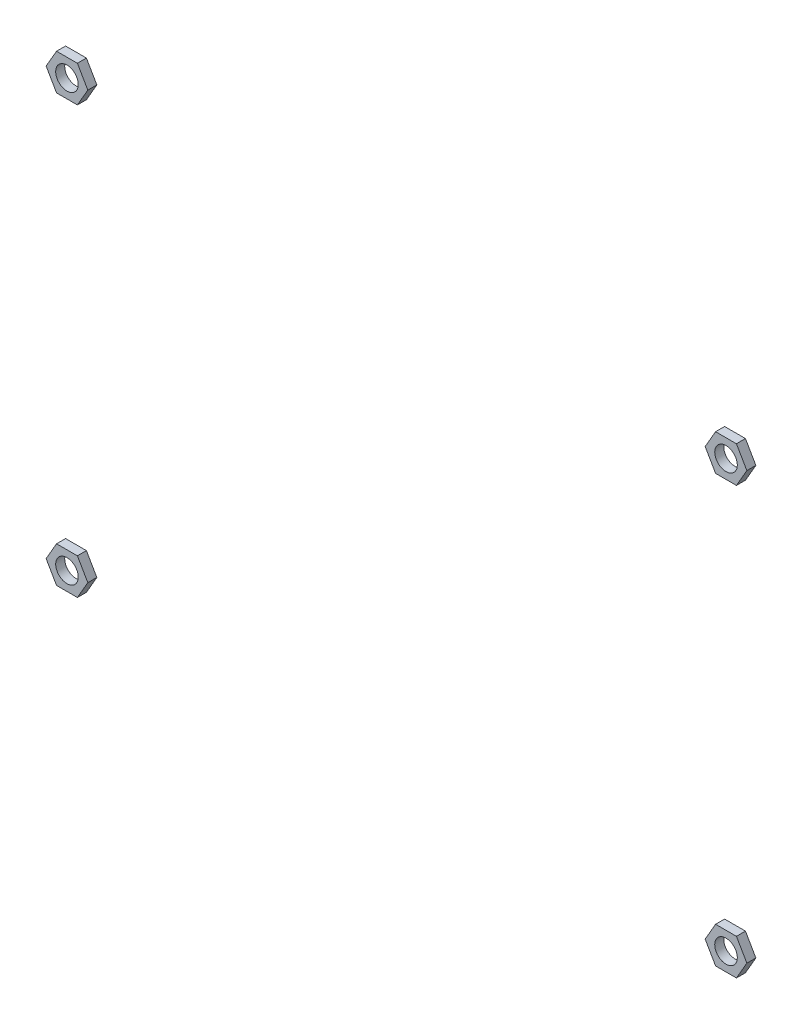
ISO-10303-21;
HEADER;
FILE_DESCRIPTION(('STEP AP214'),'2;1');
FILE_NAME('part.step','',(''),(''),'','','');
FILE_SCHEMA(('AUTOMOTIVE_DESIGN { 1 0 10303 214 1 1 1 1 }'));
ENDSEC;
DATA;
#1=APPLICATION_CONTEXT('core data for automotive mechanical design processes');
#2=APPLICATION_PROTOCOL_DEFINITION('international standard','automotive_design',2000,#1);
#3=PRODUCT_CONTEXT('',#1,'mechanical');
#4=PRODUCT('Part','Part','',(#3));
#5=PRODUCT_RELATED_PRODUCT_CATEGORY('part','',(#4));
#6=PRODUCT_DEFINITION_FORMATION('','',#4);
#7=PRODUCT_DEFINITION_CONTEXT('part definition',#1,'design');
#8=PRODUCT_DEFINITION('design','',#6,#7);
#9=PRODUCT_DEFINITION_SHAPE('','',#8);
#10=(LENGTH_UNIT() NAMED_UNIT(*) SI_UNIT(.MILLI.,.METRE.));
#11=(NAMED_UNIT(*) PLANE_ANGLE_UNIT() SI_UNIT($,.RADIAN.));
#12=(NAMED_UNIT(*) SI_UNIT($,.STERADIAN.) SOLID_ANGLE_UNIT());
#13=UNCERTAINTY_MEASURE_WITH_UNIT(LENGTH_MEASURE(1.E-05),#10,'distance_accuracy_value','');
#14=(GEOMETRIC_REPRESENTATION_CONTEXT(3) GLOBAL_UNCERTAINTY_ASSIGNED_CONTEXT((#13)) GLOBAL_UNIT_ASSIGNED_CONTEXT((#10,
#11,#12)) REPRESENTATION_CONTEXT('',''));
#15=CARTESIAN_POINT('',(0.,0.,0.));
#16=DIRECTION('',(0.,0.,1.));
#17=DIRECTION('',(1.,0.,0.));
#18=AXIS2_PLACEMENT_3D('',#15,#16,#17);
#19=CARTESIAN_POINT('',(252.801279533591,3.41990563164807,4.));
#20=DIRECTION('',(-0.866025403784439,0.5,0.));
#21=DIRECTION('',(-0.5,-0.866025403784439,0.));
#22=AXIS2_PLACEMENT_3D('',#19,#20,#21);
#23=PLANE('',#22);
#24=DIRECTION('',(0.5,0.866025403784439,0.));
#25=VECTOR('',#24,1.);
#26=CARTESIAN_POINT('',(252.801279533591,3.41990563164807,0.));
#27=LINE('',#26,#25);
#28=CARTESIAN_POINT('',(252.801279533591,3.41990563164807,0.));
#29=VERTEX_POINT('',#28);
#30=CARTESIAN_POINT('',(257.420081687108,11.4199056316481,0.));
#31=VERTEX_POINT('',#30);
#32=EDGE_CURVE('E138',#29,#31,#27,.T.);
#33=ORIENTED_EDGE('',*,*,#32,.T.);
#34=DIRECTION('',(0.,0.,-1.));
#35=VECTOR('',#34,1.);
#36=CARTESIAN_POINT('',(257.420081687108,11.4199056316481,4.));
#37=LINE('',#36,#35);
#38=CARTESIAN_POINT('',(257.420081687108,11.4199056316481,4.));
#39=VERTEX_POINT('',#38);
#40=EDGE_CURVE('E12',#39,#31,#37,.T.);
#41=ORIENTED_EDGE('',*,*,#40,.F.);
#42=DIRECTION('',(0.5,0.866025403784439,0.));
#43=VECTOR('',#42,1.);
#44=CARTESIAN_POINT('',(252.801279533591,3.41990563164807,4.));
#45=LINE('',#44,#43);
#46=CARTESIAN_POINT('',(252.801279533591,3.41990563164807,4.));
#47=VERTEX_POINT('',#46);
#48=EDGE_CURVE('E149',#47,#39,#45,.T.);
#49=ORIENTED_EDGE('',*,*,#48,.F.);
#50=DIRECTION('',(0.,0.,-1.));
#51=VECTOR('',#50,1.);
#52=CARTESIAN_POINT('',(252.801279533591,3.41990563164807,4.));
#53=LINE('',#52,#51);
#54=EDGE_CURVE('E134',#47,#29,#53,.T.);
#55=ORIENTED_EDGE('',*,*,#54,.T.);
#56=EDGE_LOOP('',(#33,#41,#49,#55));
#57=FACE_BOUND('',#56,.T.);
#58=ADVANCED_FACE('F54',(#57),#23,.F.);
#59=CARTESIAN_POINT('',(257.420081687108,11.4199056316481,4.));
#60=DIRECTION('',(-0.866025403784439,-0.5,0.));
#61=DIRECTION('',(0.5,-0.866025403784439,0.));
#62=AXIS2_PLACEMENT_3D('',#59,#60,#61);
#63=PLANE('',#62);
#64=DIRECTION('',(-0.5,0.866025403784439,0.));
#65=VECTOR('',#64,1.);
#66=CARTESIAN_POINT('',(257.420081687108,11.4199056316481,0.));
#67=LINE('',#66,#65);
#68=CARTESIAN_POINT('',(252.801279533591,19.4199056316481,0.));
#69=VERTEX_POINT('',#68);
#70=EDGE_CURVE('E141',#31,#69,#67,.T.);
#71=ORIENTED_EDGE('',*,*,#70,.T.);
#72=DIRECTION('',(0.,0.,-1.));
#73=VECTOR('',#72,1.);
#74=CARTESIAN_POINT('',(252.801279533591,19.4199056316481,4.));
#75=LINE('',#74,#73);
#76=CARTESIAN_POINT('',(252.801279533591,19.4199056316481,4.));
#77=VERTEX_POINT('',#76);
#78=EDGE_CURVE('E62',#77,#69,#75,.T.);
#79=ORIENTED_EDGE('',*,*,#78,.F.);
#80=DIRECTION('',(-0.5,0.866025403784439,0.));
#81=VECTOR('',#80,1.);
#82=CARTESIAN_POINT('',(257.420081687108,11.4199056316481,4.));
#83=LINE('',#82,#81);
#84=EDGE_CURVE('E107',#39,#77,#83,.T.);
#85=ORIENTED_EDGE('',*,*,#84,.F.);
#86=ORIENTED_EDGE('',*,*,#40,.T.);
#87=EDGE_LOOP('',(#71,#79,#85,#86));
#88=FACE_BOUND('',#87,.T.);
#89=ADVANCED_FACE('F174',(#88),#63,.F.);
#90=CARTESIAN_POINT('',(252.801279533591,19.4199056316481,4.));
#91=DIRECTION('',(0.,-1.,0.));
#92=DIRECTION('',(0.,0.,-1.));
#93=AXIS2_PLACEMENT_3D('',#90,#91,#92);
#94=PLANE('',#93);
#95=DIRECTION('',(-1.,0.,0.));
#96=VECTOR('',#95,1.);
#97=CARTESIAN_POINT('',(252.801279533591,19.4199056316481,0.));
#98=LINE('',#97,#96);
#99=CARTESIAN_POINT('',(243.563675226557,19.4199056316481,0.));
#100=VERTEX_POINT('',#99);
#101=EDGE_CURVE('E144',#69,#100,#98,.T.);
#102=ORIENTED_EDGE('',*,*,#101,.T.);
#103=DIRECTION('',(0.,0.,-1.));
#104=VECTOR('',#103,1.);
#105=CARTESIAN_POINT('',(243.563675226557,19.4199056316481,4.));
#106=LINE('',#105,#104);
#107=CARTESIAN_POINT('',(243.563675226557,19.4199056316481,4.));
#108=VERTEX_POINT('',#107);
#109=EDGE_CURVE('E129',#108,#100,#106,.T.);
#110=ORIENTED_EDGE('',*,*,#109,.F.);
#111=DIRECTION('',(-1.,0.,0.));
#112=VECTOR('',#111,1.);
#113=CARTESIAN_POINT('',(252.801279533591,19.4199056316481,4.));
#114=LINE('',#113,#112);
#115=EDGE_CURVE('E120',#77,#108,#114,.T.);
#116=ORIENTED_EDGE('',*,*,#115,.F.);
#117=ORIENTED_EDGE('',*,*,#78,.T.);
#118=EDGE_LOOP('',(#102,#110,#116,#117));
#119=FACE_BOUND('',#118,.T.);
#120=ADVANCED_FACE('F155',(#119),#94,.F.);
#121=CARTESIAN_POINT('',(243.563675226557,19.4199056316481,4.));
#122=DIRECTION('',(0.866025403784439,-0.499999999999999,0.));
#123=DIRECTION('',(0.499999999999999,0.866025403784439,0.));
#124=AXIS2_PLACEMENT_3D('',#121,#122,#123);
#125=PLANE('',#124);
#126=DIRECTION('',(-0.499999999999999,-0.866025403784439,0.));
#127=VECTOR('',#126,1.);
#128=CARTESIAN_POINT('',(243.563675226557,19.4199056316481,0.));
#129=LINE('',#128,#127);
#130=CARTESIAN_POINT('',(238.94487307304,11.4199056316481,0.));
#131=VERTEX_POINT('',#130);
#132=EDGE_CURVE('E128',#100,#131,#129,.T.);
#133=ORIENTED_EDGE('',*,*,#132,.T.);
#134=DIRECTION('',(0.,0.,-1.));
#135=VECTOR('',#134,1.);
#136=CARTESIAN_POINT('',(238.94487307304,11.4199056316481,4.));
#137=LINE('',#136,#135);
#138=CARTESIAN_POINT('',(238.94487307304,11.4199056316481,4.));
#139=VERTEX_POINT('',#138);
#140=EDGE_CURVE('E125',#139,#131,#137,.T.);
#141=ORIENTED_EDGE('',*,*,#140,.F.);
#142=DIRECTION('',(-0.499999999999999,-0.866025403784439,0.));
#143=VECTOR('',#142,1.);
#144=CARTESIAN_POINT('',(243.563675226557,19.4199056316481,4.));
#145=LINE('',#144,#143);
#146=EDGE_CURVE('E114',#108,#139,#145,.T.);
#147=ORIENTED_EDGE('',*,*,#146,.F.);
#148=ORIENTED_EDGE('',*,*,#109,.T.);
#149=EDGE_LOOP('',(#133,#141,#147,#148));
#150=FACE_BOUND('',#149,.T.);
#151=ADVANCED_FACE('F126',(#150),#125,.F.);
#152=CARTESIAN_POINT('',(238.94487307304,11.4199056316481,4.));
#153=DIRECTION('',(0.866025403784439,0.5,0.));
#154=DIRECTION('',(-0.5,0.866025403784439,0.));
#155=AXIS2_PLACEMENT_3D('',#152,#153,#154);
#156=PLANE('',#155);
#157=DIRECTION('',(0.5,-0.866025403784439,0.));
#158=VECTOR('',#157,1.);
#159=CARTESIAN_POINT('',(238.94487307304,11.4199056316481,0.));
#160=LINE('',#159,#158);
#161=CARTESIAN_POINT('',(243.563675226557,3.41990563164807,0.));
#162=VERTEX_POINT('',#161);
#163=EDGE_CURVE('E93',#131,#162,#160,.T.);
#164=ORIENTED_EDGE('',*,*,#163,.T.);
#165=DIRECTION('',(0.,0.,-1.));
#166=VECTOR('',#165,1.);
#167=CARTESIAN_POINT('',(243.563675226557,3.41990563164807,4.));
#168=LINE('',#167,#166);
#169=CARTESIAN_POINT('',(243.563675226557,3.41990563164807,4.));
#170=VERTEX_POINT('',#169);
#171=EDGE_CURVE('E130',#170,#162,#168,.T.);
#172=ORIENTED_EDGE('',*,*,#171,.F.);
#173=DIRECTION('',(0.5,-0.866025403784439,0.));
#174=VECTOR('',#173,1.);
#175=CARTESIAN_POINT('',(238.94487307304,11.4199056316481,4.));
#176=LINE('',#175,#174);
#177=EDGE_CURVE('E118',#139,#170,#176,.T.);
#178=ORIENTED_EDGE('',*,*,#177,.F.);
#179=ORIENTED_EDGE('',*,*,#140,.T.);
#180=EDGE_LOOP('',(#164,#172,#178,#179));
#181=FACE_BOUND('',#180,.T.);
#182=ADVANCED_FACE('F132',(#181),#156,.F.);
#183=CARTESIAN_POINT('',(243.563675226557,3.41990563164807,4.));
#184=DIRECTION('',(0.,1.,0.));
#185=DIRECTION('',(-1.,0.,0.));
#186=AXIS2_PLACEMENT_3D('',#183,#184,#185);
#187=PLANE('',#186);
#188=DIRECTION('',(1.,0.,0.));
#189=VECTOR('',#188,1.);
#190=CARTESIAN_POINT('',(243.563675226557,3.41990563164807,0.));
#191=LINE('',#190,#189);
#192=EDGE_CURVE('E99',#162,#29,#191,.T.);
#193=ORIENTED_EDGE('',*,*,#192,.T.);
#194=ORIENTED_EDGE('',*,*,#54,.F.);
#195=DIRECTION('',(1.,0.,0.));
#196=VECTOR('',#195,1.);
#197=CARTESIAN_POINT('',(243.563675226557,3.41990563164807,4.));
#198=LINE('',#197,#196);
#199=EDGE_CURVE('E70',#170,#47,#198,.T.);
#200=ORIENTED_EDGE('',*,*,#199,.F.);
#201=ORIENTED_EDGE('',*,*,#171,.T.);
#202=EDGE_LOOP('',(#193,#194,#200,#201));
#203=FACE_BOUND('',#202,.T.);
#204=ADVANCED_FACE('F162',(#203),#187,.F.);
#205=CARTESIAN_POINT('',(292.,0.,4.));
#206=DIRECTION('',(0.,0.,1.));
#207=DIRECTION('',(1.,0.,0.));
#208=AXIS2_PLACEMENT_3D('',#205,#206,#207);
#209=PLANE('',#208);
#210=CARTESIAN_POINT('',(248.182477380074,11.4199056316481,4.));
#211=DIRECTION('',(0.,0.,-1.));
#212=DIRECTION('',(-1.,0.,0.));
#213=AXIS2_PLACEMENT_3D('',#210,#211,#212);
#214=CIRCLE('',#213,5.);
#215=CARTESIAN_POINT('',(243.182477380074,11.4199056316481,4.));
#216=VERTEX_POINT('',#215);
#217=EDGE_CURVE('E142',#216,#216,#214,.T.);
#218=ORIENTED_EDGE('',*,*,#217,.T.);
#219=EDGE_LOOP('',(#218));
#220=FACE_BOUND('',#219,.T.);
#221=ORIENTED_EDGE('',*,*,#48,.T.);
#222=ORIENTED_EDGE('',*,*,#84,.T.);
#223=ORIENTED_EDGE('',*,*,#115,.T.);
#224=ORIENTED_EDGE('',*,*,#146,.T.);
#225=ORIENTED_EDGE('',*,*,#177,.T.);
#226=ORIENTED_EDGE('',*,*,#199,.T.);
#227=EDGE_LOOP('',(#221,#222,#223,#224,#225,#226));
#228=FACE_BOUND('',#227,.T.);
#229=ADVANCED_FACE('F116',(#220,#228),#209,.T.);
#230=CARTESIAN_POINT('',(292.,0.,0.));
#231=DIRECTION('',(0.,0.,1.));
#232=DIRECTION('',(1.,0.,0.));
#233=AXIS2_PLACEMENT_3D('',#230,#231,#232);
#234=PLANE('',#233);
#235=CARTESIAN_POINT('',(248.182477380074,11.4199056316481,0.));
#236=DIRECTION('',(0.,0.,-1.));
#237=DIRECTION('',(-1.,0.,0.));
#238=AXIS2_PLACEMENT_3D('',#235,#236,#237);
#239=CIRCLE('',#238,5.);
#240=CARTESIAN_POINT('',(243.182477380074,11.4199056316481,0.));
#241=VERTEX_POINT('',#240);
#242=EDGE_CURVE('E261',#241,#241,#239,.T.);
#243=ORIENTED_EDGE('',*,*,#242,.F.);
#244=EDGE_LOOP('',(#243));
#245=FACE_BOUND('',#244,.T.);
#246=ORIENTED_EDGE('',*,*,#32,.F.);
#247=ORIENTED_EDGE('',*,*,#192,.F.);
#248=ORIENTED_EDGE('',*,*,#163,.F.);
#249=ORIENTED_EDGE('',*,*,#132,.F.);
#250=ORIENTED_EDGE('',*,*,#101,.F.);
#251=ORIENTED_EDGE('',*,*,#70,.F.);
#252=EDGE_LOOP('',(#246,#247,#248,#249,#250,#251));
#253=FACE_BOUND('',#252,.T.);
#254=ADVANCED_FACE('F158',(#245,#253),#234,.F.);
#255=CARTESIAN_POINT('',(248.182477380074,11.4199056316481,4.));
#256=DIRECTION('',(0.,0.,-1.));
#257=DIRECTION('',(-1.,0.,0.));
#258=AXIS2_PLACEMENT_3D('',#255,#256,#257);
#259=CYLINDRICAL_SURFACE('',#258,5.);
#260=ORIENTED_EDGE('',*,*,#217,.F.);
#261=EDGE_LOOP('',(#260));
#262=FACE_BOUND('',#261,.T.);
#263=ORIENTED_EDGE('',*,*,#242,.T.);
#264=EDGE_LOOP('',(#263));
#265=FACE_BOUND('',#264,.T.);
#266=ADVANCED_FACE('F214',(#262,#265),#259,.F.);
#267=CLOSED_SHELL('',(#58,#89,#120,#151,#182,#204,#229,#254,#266));
#268=MANIFOLD_SOLID_BREP('B2',#267);
#269=CARTESIAN_POINT('',(252.801279533591,192.419905631648,4.));
#270=DIRECTION('',(-0.866025403784439,0.5,0.));
#271=DIRECTION('',(-0.5,-0.866025403784439,0.));
#272=AXIS2_PLACEMENT_3D('',#269,#270,#271);
#273=PLANE('',#272);
#274=DIRECTION('',(0.5,0.866025403784439,0.));
#275=VECTOR('',#274,1.);
#276=CARTESIAN_POINT('',(252.801279533591,192.419905631648,0.));
#277=LINE('',#276,#275);
#278=CARTESIAN_POINT('',(252.801279533591,192.419905631648,0.));
#279=VERTEX_POINT('',#278);
#280=CARTESIAN_POINT('',(257.420081687108,200.419905631648,0.));
#281=VERTEX_POINT('',#280);
#282=EDGE_CURVE('E368',#279,#281,#277,.T.);
#283=ORIENTED_EDGE('',*,*,#282,.T.);
#284=DIRECTION('',(0.,0.,-1.));
#285=VECTOR('',#284,1.);
#286=CARTESIAN_POINT('',(257.420081687108,200.419905631648,4.));
#287=LINE('',#286,#285);
#288=CARTESIAN_POINT('',(257.420081687108,200.419905631648,4.));
#289=VERTEX_POINT('',#288);
#290=EDGE_CURVE('E52',#289,#281,#287,.T.);
#291=ORIENTED_EDGE('',*,*,#290,.F.);
#292=DIRECTION('',(0.5,0.866025403784439,0.));
#293=VECTOR('',#292,1.);
#294=CARTESIAN_POINT('',(252.801279533591,192.419905631648,4.));
#295=LINE('',#294,#293);
#296=CARTESIAN_POINT('',(252.801279533591,192.419905631648,4.));
#297=VERTEX_POINT('',#296);
#298=EDGE_CURVE('E385',#297,#289,#295,.T.);
#299=ORIENTED_EDGE('',*,*,#298,.F.);
#300=DIRECTION('',(0.,0.,-1.));
#301=VECTOR('',#300,1.);
#302=CARTESIAN_POINT('',(252.801279533591,192.419905631648,4.));
#303=LINE('',#302,#301);
#304=EDGE_CURVE('E364',#297,#279,#303,.T.);
#305=ORIENTED_EDGE('',*,*,#304,.T.);
#306=EDGE_LOOP('',(#283,#291,#299,#305));
#307=FACE_BOUND('',#306,.T.);
#308=ADVANCED_FACE('F279',(#307),#273,.F.);
#309=CARTESIAN_POINT('',(257.420081687108,200.419905631648,4.));
#310=DIRECTION('',(-0.866025403784439,-0.5,0.));
#311=DIRECTION('',(0.5,-0.866025403784439,0.));
#312=AXIS2_PLACEMENT_3D('',#309,#310,#311);
#313=PLANE('',#312);
#314=DIRECTION('',(-0.5,0.866025403784439,0.));
#315=VECTOR('',#314,1.);
#316=CARTESIAN_POINT('',(257.420081687108,200.419905631648,0.));
#317=LINE('',#316,#315);
#318=CARTESIAN_POINT('',(252.801279533591,208.419905631648,0.));
#319=VERTEX_POINT('',#318);
#320=EDGE_CURVE('E372',#281,#319,#317,.T.);
#321=ORIENTED_EDGE('',*,*,#320,.T.);
#322=DIRECTION('',(0.,0.,-1.));
#323=VECTOR('',#322,1.);
#324=CARTESIAN_POINT('',(252.801279533591,208.419905631648,4.));
#325=LINE('',#324,#323);
#326=CARTESIAN_POINT('',(252.801279533591,208.419905631648,4.));
#327=VERTEX_POINT('',#326);
#328=EDGE_CURVE('E288',#327,#319,#325,.T.);
#329=ORIENTED_EDGE('',*,*,#328,.F.);
#330=DIRECTION('',(-0.5,0.866025403784439,0.));
#331=VECTOR('',#330,1.);
#332=CARTESIAN_POINT('',(257.420081687108,200.419905631648,4.));
#333=LINE('',#332,#331);
#334=EDGE_CURVE('E333',#289,#327,#333,.T.);
#335=ORIENTED_EDGE('',*,*,#334,.F.);
#336=ORIENTED_EDGE('',*,*,#290,.T.);
#337=EDGE_LOOP('',(#321,#329,#335,#336));
#338=FACE_BOUND('',#337,.T.);
#339=ADVANCED_FACE('F414',(#338),#313,.F.);
#340=CARTESIAN_POINT('',(252.801279533591,208.419905631648,4.));
#341=DIRECTION('',(0.,-1.,0.));
#342=DIRECTION('',(0.,0.,-1.));
#343=AXIS2_PLACEMENT_3D('',#340,#341,#342);
#344=PLANE('',#343);
#345=DIRECTION('',(-1.,0.,0.));
#346=VECTOR('',#345,1.);
#347=CARTESIAN_POINT('',(252.801279533591,208.419905631648,0.));
#348=LINE('',#347,#346);
#349=CARTESIAN_POINT('',(243.563675226557,208.419905631648,0.));
#350=VERTEX_POINT('',#349);
#351=EDGE_CURVE('E376',#319,#350,#348,.T.);
#352=ORIENTED_EDGE('',*,*,#351,.T.);
#353=DIRECTION('',(0.,0.,-1.));
#354=VECTOR('',#353,1.);
#355=CARTESIAN_POINT('',(243.563675226557,208.419905631648,4.));
#356=LINE('',#355,#354);
#357=CARTESIAN_POINT('',(243.563675226557,208.419905631648,4.));
#358=VERTEX_POINT('',#357);
#359=EDGE_CURVE('E357',#358,#350,#356,.T.);
#360=ORIENTED_EDGE('',*,*,#359,.F.);
#361=DIRECTION('',(-1.,0.,0.));
#362=VECTOR('',#361,1.);
#363=CARTESIAN_POINT('',(252.801279533591,208.419905631648,4.));
#364=LINE('',#363,#362);
#365=EDGE_CURVE('E346',#327,#358,#364,.T.);
#366=ORIENTED_EDGE('',*,*,#365,.F.);
#367=ORIENTED_EDGE('',*,*,#328,.T.);
#368=EDGE_LOOP('',(#352,#360,#366,#367));
#369=FACE_BOUND('',#368,.T.);
#370=ADVANCED_FACE('F395',(#369),#344,.F.);
#371=CARTESIAN_POINT('',(243.563675226557,208.419905631648,4.));
#372=DIRECTION('',(0.866025403784439,-0.499999999999999,0.));
#373=DIRECTION('',(0.499999999999999,0.866025403784439,0.));
#374=AXIS2_PLACEMENT_3D('',#371,#372,#373);
#375=PLANE('',#374);
#376=DIRECTION('',(-0.499999999999999,-0.866025403784439,0.));
#377=VECTOR('',#376,1.);
#378=CARTESIAN_POINT('',(243.563675226557,208.419905631648,0.));
#379=LINE('',#378,#377);
#380=CARTESIAN_POINT('',(238.94487307304,200.419905631648,0.));
#381=VERTEX_POINT('',#380);
#382=EDGE_CURVE('E355',#350,#381,#379,.T.);
#383=ORIENTED_EDGE('',*,*,#382,.T.);
#384=DIRECTION('',(0.,0.,-1.));
#385=VECTOR('',#384,1.);
#386=CARTESIAN_POINT('',(238.94487307304,200.419905631648,4.));
#387=LINE('',#386,#385);
#388=CARTESIAN_POINT('',(238.94487307304,200.419905631648,4.));
#389=VERTEX_POINT('',#388);
#390=EDGE_CURVE('E352',#389,#381,#387,.T.);
#391=ORIENTED_EDGE('',*,*,#390,.F.);
#392=DIRECTION('',(-0.499999999999999,-0.866025403784439,0.));
#393=VECTOR('',#392,1.);
#394=CARTESIAN_POINT('',(243.563675226557,208.419905631648,4.));
#395=LINE('',#394,#393);
#396=EDGE_CURVE('E340',#358,#389,#395,.T.);
#397=ORIENTED_EDGE('',*,*,#396,.F.);
#398=ORIENTED_EDGE('',*,*,#359,.T.);
#399=EDGE_LOOP('',(#383,#391,#397,#398));
#400=FACE_BOUND('',#399,.T.);
#401=ADVANCED_FACE('F353',(#400),#375,.F.);
#402=CARTESIAN_POINT('',(238.94487307304,200.419905631648,4.));
#403=DIRECTION('',(0.866025403784439,0.5,0.));
#404=DIRECTION('',(-0.5,0.866025403784439,0.));
#405=AXIS2_PLACEMENT_3D('',#402,#403,#404);
#406=PLANE('',#405);
#407=DIRECTION('',(0.5,-0.866025403784439,0.));
#408=VECTOR('',#407,1.);
#409=CARTESIAN_POINT('',(238.94487307304,200.419905631648,0.));
#410=LINE('',#409,#408);
#411=CARTESIAN_POINT('',(243.563675226557,192.419905631648,0.));
#412=VERTEX_POINT('',#411);
#413=EDGE_CURVE('E319',#381,#412,#410,.T.);
#414=ORIENTED_EDGE('',*,*,#413,.T.);
#415=DIRECTION('',(0.,0.,-1.));
#416=VECTOR('',#415,1.);
#417=CARTESIAN_POINT('',(243.563675226557,192.419905631648,4.));
#418=LINE('',#417,#416);
#419=CARTESIAN_POINT('',(243.563675226557,192.419905631648,4.));
#420=VERTEX_POINT('',#419);
#421=EDGE_CURVE('E358',#420,#412,#418,.T.);
#422=ORIENTED_EDGE('',*,*,#421,.F.);
#423=DIRECTION('',(0.5,-0.866025403784439,0.));
#424=VECTOR('',#423,1.);
#425=CARTESIAN_POINT('',(238.94487307304,200.419905631648,4.));
#426=LINE('',#425,#424);
#427=EDGE_CURVE('E344',#389,#420,#426,.T.);
#428=ORIENTED_EDGE('',*,*,#427,.F.);
#429=ORIENTED_EDGE('',*,*,#390,.T.);
#430=EDGE_LOOP('',(#414,#422,#428,#429));
#431=FACE_BOUND('',#430,.T.);
#432=ADVANCED_FACE('F360',(#431),#406,.F.);
#433=CARTESIAN_POINT('',(243.563675226557,192.419905631648,4.));
#434=DIRECTION('',(0.,1.,0.));
#435=DIRECTION('',(-1.,0.,0.));
#436=AXIS2_PLACEMENT_3D('',#433,#434,#435);
#437=PLANE('',#436);
#438=DIRECTION('',(1.,0.,0.));
#439=VECTOR('',#438,1.);
#440=CARTESIAN_POINT('',(243.563675226557,192.419905631648,0.));
#441=LINE('',#440,#439);
#442=EDGE_CURVE('E325',#412,#279,#441,.T.);
#443=ORIENTED_EDGE('',*,*,#442,.T.);
#444=ORIENTED_EDGE('',*,*,#304,.F.);
#445=DIRECTION('',(1.,0.,0.));
#446=VECTOR('',#445,1.);
#447=CARTESIAN_POINT('',(243.563675226557,192.419905631648,4.));
#448=LINE('',#447,#446);
#449=EDGE_CURVE('E296',#420,#297,#448,.T.);
#450=ORIENTED_EDGE('',*,*,#449,.F.);
#451=ORIENTED_EDGE('',*,*,#421,.T.);
#452=EDGE_LOOP('',(#443,#444,#450,#451));
#453=FACE_BOUND('',#452,.T.);
#454=ADVANCED_FACE('F402',(#453),#437,.F.);
#455=CARTESIAN_POINT('',(292.,189.,4.));
#456=DIRECTION('',(0.,0.,1.));
#457=DIRECTION('',(1.,0.,0.));
#458=AXIS2_PLACEMENT_3D('',#455,#456,#457);
#459=PLANE('',#458);
#460=CARTESIAN_POINT('',(248.182477380074,200.419905631648,4.));
#461=DIRECTION('',(0.,0.,-1.));
#462=DIRECTION('',(-1.,0.,0.));
#463=AXIS2_PLACEMENT_3D('',#460,#461,#462);
#464=CIRCLE('',#463,5.);
#465=CARTESIAN_POINT('',(243.182477380074,200.419905631648,4.));
#466=VERTEX_POINT('',#465);
#467=EDGE_CURVE('E373',#466,#466,#464,.T.);
#468=ORIENTED_EDGE('',*,*,#467,.T.);
#469=EDGE_LOOP('',(#468));
#470=FACE_BOUND('',#469,.T.);
#471=ORIENTED_EDGE('',*,*,#298,.T.);
#472=ORIENTED_EDGE('',*,*,#334,.T.);
#473=ORIENTED_EDGE('',*,*,#365,.T.);
#474=ORIENTED_EDGE('',*,*,#396,.T.);
#475=ORIENTED_EDGE('',*,*,#427,.T.);
#476=ORIENTED_EDGE('',*,*,#449,.T.);
#477=EDGE_LOOP('',(#471,#472,#473,#474,#475,#476));
#478=FACE_BOUND('',#477,.T.);
#479=ADVANCED_FACE('F342',(#470,#478),#459,.T.);
#480=CARTESIAN_POINT('',(292.,189.,0.));
#481=DIRECTION('',(0.,0.,1.));
#482=DIRECTION('',(1.,0.,0.));
#483=AXIS2_PLACEMENT_3D('',#480,#481,#482);
#484=PLANE('',#483);
#485=CARTESIAN_POINT('',(248.182477380074,200.419905631648,0.));
#486=DIRECTION('',(0.,0.,-1.));
#487=DIRECTION('',(-1.,0.,0.));
#488=AXIS2_PLACEMENT_3D('',#485,#486,#487);
#489=CIRCLE('',#488,5.);
#490=CARTESIAN_POINT('',(243.182477380074,200.419905631648,0.));
#491=VERTEX_POINT('',#490);
#492=EDGE_CURVE('E501',#491,#491,#489,.T.);
#493=ORIENTED_EDGE('',*,*,#492,.F.);
#494=EDGE_LOOP('',(#493));
#495=FACE_BOUND('',#494,.T.);
#496=ORIENTED_EDGE('',*,*,#282,.F.);
#497=ORIENTED_EDGE('',*,*,#442,.F.);
#498=ORIENTED_EDGE('',*,*,#413,.F.);
#499=ORIENTED_EDGE('',*,*,#382,.F.);
#500=ORIENTED_EDGE('',*,*,#351,.F.);
#501=ORIENTED_EDGE('',*,*,#320,.F.);
#502=EDGE_LOOP('',(#496,#497,#498,#499,#500,#501));
#503=FACE_BOUND('',#502,.T.);
#504=ADVANCED_FACE('F398',(#495,#503),#484,.F.);
#505=CARTESIAN_POINT('',(248.182477380074,200.419905631648,4.));
#506=DIRECTION('',(0.,0.,-1.));
#507=DIRECTION('',(-1.,0.,0.));
#508=AXIS2_PLACEMENT_3D('',#505,#506,#507);
#509=CYLINDRICAL_SURFACE('',#508,5.);
#510=ORIENTED_EDGE('',*,*,#467,.F.);
#511=EDGE_LOOP('',(#510));
#512=FACE_BOUND('',#511,.T.);
#513=ORIENTED_EDGE('',*,*,#492,.T.);
#514=EDGE_LOOP('',(#513));
#515=FACE_BOUND('',#514,.T.);
#516=ADVANCED_FACE('F454',(#512,#515),#509,.F.);
#517=CLOSED_SHELL('',(#308,#339,#370,#401,#432,#454,#479,#504,#516));
#518=MANIFOLD_SOLID_BREP('B6',#517);
#519=CARTESIAN_POINT('',(-39.1987204664091,192.419905631648,4.));
#520=DIRECTION('',(-0.866025403784439,0.5,0.));
#521=DIRECTION('',(-0.5,-0.866025403784439,0.));
#522=AXIS2_PLACEMENT_3D('',#519,#520,#521);
#523=PLANE('',#522);
#524=DIRECTION('',(0.5,0.866025403784439,0.));
#525=VECTOR('',#524,1.);
#526=CARTESIAN_POINT('',(-39.1987204664091,192.419905631648,0.));
#527=LINE('',#526,#525);
#528=CARTESIAN_POINT('',(-39.1987204664091,192.419905631648,0.));
#529=VERTEX_POINT('',#528);
#530=CARTESIAN_POINT('',(-34.5799183128921,200.419905631648,0.));
#531=VERTEX_POINT('',#530);
#532=EDGE_CURVE('E607',#529,#531,#527,.T.);
#533=ORIENTED_EDGE('',*,*,#532,.T.);
#534=DIRECTION('',(0.,0.,-1.));
#535=VECTOR('',#534,1.);
#536=CARTESIAN_POINT('',(-34.5799183128921,200.419905631648,4.));
#537=LINE('',#536,#535);
#538=CARTESIAN_POINT('',(-34.5799183128921,200.419905631648,4.));
#539=VERTEX_POINT('',#538);
#540=EDGE_CURVE('E277',#539,#531,#537,.T.);
#541=ORIENTED_EDGE('',*,*,#540,.F.);
#542=DIRECTION('',(0.5,0.866025403784439,0.));
#543=VECTOR('',#542,1.);
#544=CARTESIAN_POINT('',(-39.1987204664091,192.419905631648,4.));
#545=LINE('',#544,#543);
#546=CARTESIAN_POINT('',(-39.1987204664091,192.419905631648,4.));
#547=VERTEX_POINT('',#546);
#548=EDGE_CURVE('E618',#547,#539,#545,.T.);
#549=ORIENTED_EDGE('',*,*,#548,.F.);
#550=DIRECTION('',(0.,0.,-1.));
#551=VECTOR('',#550,1.);
#552=CARTESIAN_POINT('',(-39.1987204664091,192.419905631648,4.));
#553=LINE('',#552,#551);
#554=EDGE_CURVE('E603',#547,#529,#553,.T.);
#555=ORIENTED_EDGE('',*,*,#554,.T.);
#556=EDGE_LOOP('',(#533,#541,#549,#555));
#557=FACE_BOUND('',#556,.T.);
#558=ADVANCED_FACE('F523',(#557),#523,.F.);
#559=CARTESIAN_POINT('',(-34.5799183128921,200.419905631648,4.));
#560=DIRECTION('',(-0.866025403784439,-0.5,0.));
#561=DIRECTION('',(0.5,-0.866025403784439,0.));
#562=AXIS2_PLACEMENT_3D('',#559,#560,#561);
#563=PLANE('',#562);
#564=DIRECTION('',(-0.5,0.866025403784439,0.));
#565=VECTOR('',#564,1.);
#566=CARTESIAN_POINT('',(-34.5799183128921,200.419905631648,0.));
#567=LINE('',#566,#565);
#568=CARTESIAN_POINT('',(-39.1987204664092,208.419905631648,0.));
#569=VERTEX_POINT('',#568);
#570=EDGE_CURVE('E610',#531,#569,#567,.T.);
#571=ORIENTED_EDGE('',*,*,#570,.T.);
#572=DIRECTION('',(0.,0.,-1.));
#573=VECTOR('',#572,1.);
#574=CARTESIAN_POINT('',(-39.1987204664092,208.419905631648,4.));
#575=LINE('',#574,#573);
#576=CARTESIAN_POINT('',(-39.1987204664092,208.419905631648,4.));
#577=VERTEX_POINT('',#576);
#578=EDGE_CURVE('E531',#577,#569,#575,.T.);
#579=ORIENTED_EDGE('',*,*,#578,.F.);
#580=DIRECTION('',(-0.5,0.866025403784439,0.));
#581=VECTOR('',#580,1.);
#582=CARTESIAN_POINT('',(-34.5799183128921,200.419905631648,4.));
#583=LINE('',#582,#581);
#584=EDGE_CURVE('E576',#539,#577,#583,.T.);
#585=ORIENTED_EDGE('',*,*,#584,.F.);
#586=ORIENTED_EDGE('',*,*,#540,.T.);
#587=EDGE_LOOP('',(#571,#579,#585,#586));
#588=FACE_BOUND('',#587,.T.);
#589=ADVANCED_FACE('F643',(#588),#563,.F.);
#590=CARTESIAN_POINT('',(-39.1987204664092,208.419905631648,4.));
#591=DIRECTION('',(0.,-1.,0.));
#592=DIRECTION('',(0.,0.,-1.));
#593=AXIS2_PLACEMENT_3D('',#590,#591,#592);
#594=PLANE('',#593);
#595=DIRECTION('',(-1.,0.,0.));
#596=VECTOR('',#595,1.);
#597=CARTESIAN_POINT('',(-39.1987204664092,208.419905631648,0.));
#598=LINE('',#597,#596);
#599=CARTESIAN_POINT('',(-48.4363247734432,208.419905631648,0.));
#600=VERTEX_POINT('',#599);
#601=EDGE_CURVE('E613',#569,#600,#598,.T.);
#602=ORIENTED_EDGE('',*,*,#601,.T.);
#603=DIRECTION('',(0.,0.,-1.));
#604=VECTOR('',#603,1.);
#605=CARTESIAN_POINT('',(-48.4363247734432,208.419905631648,4.));
#606=LINE('',#605,#604);
#607=CARTESIAN_POINT('',(-48.4363247734432,208.419905631648,4.));
#608=VERTEX_POINT('',#607);
#609=EDGE_CURVE('E598',#608,#600,#606,.T.);
#610=ORIENTED_EDGE('',*,*,#609,.F.);
#611=DIRECTION('',(-1.,0.,0.));
#612=VECTOR('',#611,1.);
#613=CARTESIAN_POINT('',(-39.1987204664092,208.419905631648,4.));
#614=LINE('',#613,#612);
#615=EDGE_CURVE('E589',#577,#608,#614,.T.);
#616=ORIENTED_EDGE('',*,*,#615,.F.);
#617=ORIENTED_EDGE('',*,*,#578,.T.);
#618=EDGE_LOOP('',(#602,#610,#616,#617));
#619=FACE_BOUND('',#618,.T.);
#620=ADVANCED_FACE('F624',(#619),#594,.F.);
#621=CARTESIAN_POINT('',(-48.4363247734432,208.419905631648,4.));
#622=DIRECTION('',(0.866025403784439,-0.499999999999999,0.));
#623=DIRECTION('',(0.499999999999999,0.866025403784439,0.));
#624=AXIS2_PLACEMENT_3D('',#621,#622,#623);
#625=PLANE('',#624);
#626=DIRECTION('',(-0.499999999999999,-0.866025403784439,0.));
#627=VECTOR('',#626,1.);
#628=CARTESIAN_POINT('',(-48.4363247734432,208.419905631648,0.));
#629=LINE('',#628,#627);
#630=CARTESIAN_POINT('',(-53.0551269269602,200.419905631648,0.));
#631=VERTEX_POINT('',#630);
#632=EDGE_CURVE('E597',#600,#631,#629,.T.);
#633=ORIENTED_EDGE('',*,*,#632,.T.);
#634=DIRECTION('',(0.,0.,-1.));
#635=VECTOR('',#634,1.);
#636=CARTESIAN_POINT('',(-53.0551269269602,200.419905631648,4.));
#637=LINE('',#636,#635);
#638=CARTESIAN_POINT('',(-53.0551269269602,200.419905631648,4.));
#639=VERTEX_POINT('',#638);
#640=EDGE_CURVE('E594',#639,#631,#637,.T.);
#641=ORIENTED_EDGE('',*,*,#640,.F.);
#642=DIRECTION('',(-0.499999999999999,-0.866025403784439,0.));
#643=VECTOR('',#642,1.);
#644=CARTESIAN_POINT('',(-48.4363247734432,208.419905631648,4.));
#645=LINE('',#644,#643);
#646=EDGE_CURVE('E583',#608,#639,#645,.T.);
#647=ORIENTED_EDGE('',*,*,#646,.F.);
#648=ORIENTED_EDGE('',*,*,#609,.T.);
#649=EDGE_LOOP('',(#633,#641,#647,#648));
#650=FACE_BOUND('',#649,.T.);
#651=ADVANCED_FACE('F595',(#650),#625,.F.);
#652=CARTESIAN_POINT('',(-53.0551269269602,200.419905631648,4.));
#653=DIRECTION('',(0.866025403784439,0.5,0.));
#654=DIRECTION('',(-0.5,0.866025403784439,0.));
#655=AXIS2_PLACEMENT_3D('',#652,#653,#654);
#656=PLANE('',#655);
#657=DIRECTION('',(0.5,-0.866025403784439,0.));
#658=VECTOR('',#657,1.);
#659=CARTESIAN_POINT('',(-53.0551269269602,200.419905631648,0.));
#660=LINE('',#659,#658);
#661=CARTESIAN_POINT('',(-48.4363247734432,192.419905631648,0.));
#662=VERTEX_POINT('',#661);
#663=EDGE_CURVE('E562',#631,#662,#660,.T.);
#664=ORIENTED_EDGE('',*,*,#663,.T.);
#665=DIRECTION('',(0.,0.,-1.));
#666=VECTOR('',#665,1.);
#667=CARTESIAN_POINT('',(-48.4363247734432,192.419905631648,4.));
#668=LINE('',#667,#666);
#669=CARTESIAN_POINT('',(-48.4363247734432,192.419905631648,4.));
#670=VERTEX_POINT('',#669);
#671=EDGE_CURVE('E599',#670,#662,#668,.T.);
#672=ORIENTED_EDGE('',*,*,#671,.F.);
#673=DIRECTION('',(0.5,-0.866025403784439,0.));
#674=VECTOR('',#673,1.);
#675=CARTESIAN_POINT('',(-53.0551269269602,200.419905631648,4.));
#676=LINE('',#675,#674);
#677=EDGE_CURVE('E587',#639,#670,#676,.T.);
#678=ORIENTED_EDGE('',*,*,#677,.F.);
#679=ORIENTED_EDGE('',*,*,#640,.T.);
#680=EDGE_LOOP('',(#664,#672,#678,#679));
#681=FACE_BOUND('',#680,.T.);
#682=ADVANCED_FACE('F601',(#681),#656,.F.);
#683=CARTESIAN_POINT('',(-48.4363247734432,192.419905631648,4.));
#684=DIRECTION('',(0.,1.,0.));
#685=DIRECTION('',(-1.,0.,0.));
#686=AXIS2_PLACEMENT_3D('',#683,#684,#685);
#687=PLANE('',#686);
#688=DIRECTION('',(1.,0.,0.));
#689=VECTOR('',#688,1.);
#690=CARTESIAN_POINT('',(-48.4363247734432,192.419905631648,0.));
#691=LINE('',#690,#689);
#692=EDGE_CURVE('E568',#662,#529,#691,.T.);
#693=ORIENTED_EDGE('',*,*,#692,.T.);
#694=ORIENTED_EDGE('',*,*,#554,.F.);
#695=DIRECTION('',(1.,0.,0.));
#696=VECTOR('',#695,1.);
#697=CARTESIAN_POINT('',(-48.4363247734432,192.419905631648,4.));
#698=LINE('',#697,#696);
#699=EDGE_CURVE('E539',#670,#547,#698,.T.);
#700=ORIENTED_EDGE('',*,*,#699,.F.);
#701=ORIENTED_EDGE('',*,*,#671,.T.);
#702=EDGE_LOOP('',(#693,#694,#700,#701));
#703=FACE_BOUND('',#702,.T.);
#704=ADVANCED_FACE('F631',(#703),#687,.F.);
#705=CARTESIAN_POINT('',(0.,189.,4.));
#706=DIRECTION('',(0.,0.,1.));
#707=DIRECTION('',(1.,0.,0.));
#708=AXIS2_PLACEMENT_3D('',#705,#706,#707);
#709=PLANE('',#708);
#710=CARTESIAN_POINT('',(-43.8175226199262,200.419905631648,4.));
#711=DIRECTION('',(0.,0.,-1.));
#712=DIRECTION('',(-1.,0.,0.));
#713=AXIS2_PLACEMENT_3D('',#710,#711,#712);
#714=CIRCLE('',#713,5.);
#715=CARTESIAN_POINT('',(-48.8175226199261,200.419905631648,4.));
#716=VERTEX_POINT('',#715);
#717=EDGE_CURVE('E611',#716,#716,#714,.T.);
#718=ORIENTED_EDGE('',*,*,#717,.T.);
#719=EDGE_LOOP('',(#718));
#720=FACE_BOUND('',#719,.T.);
#721=ORIENTED_EDGE('',*,*,#548,.T.);
#722=ORIENTED_EDGE('',*,*,#584,.T.);
#723=ORIENTED_EDGE('',*,*,#615,.T.);
#724=ORIENTED_EDGE('',*,*,#646,.T.);
#725=ORIENTED_EDGE('',*,*,#677,.T.);
#726=ORIENTED_EDGE('',*,*,#699,.T.);
#727=EDGE_LOOP('',(#721,#722,#723,#724,#725,#726));
#728=FACE_BOUND('',#727,.T.);
#729=ADVANCED_FACE('F585',(#720,#728),#709,.T.);
#730=CARTESIAN_POINT('',(0.,189.,0.));
#731=DIRECTION('',(0.,0.,1.));
#732=DIRECTION('',(1.,0.,0.));
#733=AXIS2_PLACEMENT_3D('',#730,#731,#732);
#734=PLANE('',#733);
#735=CARTESIAN_POINT('',(-43.8175226199262,200.419905631648,0.));
#736=DIRECTION('',(0.,0.,-1.));
#737=DIRECTION('',(-1.,0.,0.));
#738=AXIS2_PLACEMENT_3D('',#735,#736,#737);
#739=CIRCLE('',#738,5.);
#740=CARTESIAN_POINT('',(-48.8175226199261,200.419905631648,0.));
#741=VERTEX_POINT('',#740);
#742=EDGE_CURVE('E730',#741,#741,#739,.T.);
#743=ORIENTED_EDGE('',*,*,#742,.F.);
#744=EDGE_LOOP('',(#743));
#745=FACE_BOUND('',#744,.T.);
#746=ORIENTED_EDGE('',*,*,#532,.F.);
#747=ORIENTED_EDGE('',*,*,#692,.F.);
#748=ORIENTED_EDGE('',*,*,#663,.F.);
#749=ORIENTED_EDGE('',*,*,#632,.F.);
#750=ORIENTED_EDGE('',*,*,#601,.F.);
#751=ORIENTED_EDGE('',*,*,#570,.F.);
#752=EDGE_LOOP('',(#746,#747,#748,#749,#750,#751));
#753=FACE_BOUND('',#752,.T.);
#754=ADVANCED_FACE('F627',(#745,#753),#734,.F.);
#755=CARTESIAN_POINT('',(-43.8175226199262,200.419905631648,4.));
#756=DIRECTION('',(0.,0.,-1.));
#757=DIRECTION('',(-1.,0.,0.));
#758=AXIS2_PLACEMENT_3D('',#755,#756,#757);
#759=CYLINDRICAL_SURFACE('',#758,5.);
#760=ORIENTED_EDGE('',*,*,#717,.F.);
#761=EDGE_LOOP('',(#760));
#762=FACE_BOUND('',#761,.T.);
#763=ORIENTED_EDGE('',*,*,#742,.T.);
#764=EDGE_LOOP('',(#763));
#765=FACE_BOUND('',#764,.T.);
#766=ADVANCED_FACE('F683',(#762,#765),#759,.F.);
#767=CLOSED_SHELL('',(#558,#589,#620,#651,#682,#704,#729,#754,#766));
#768=MANIFOLD_SOLID_BREP('B46',#767);
#769=CARTESIAN_POINT('',(-39.1987204664091,3.41990563164807,4.));
#770=DIRECTION('',(-0.866025403784439,0.5,0.));
#771=DIRECTION('',(-0.5,-0.866025403784439,0.));
#772=AXIS2_PLACEMENT_3D('',#769,#770,#771);
#773=PLANE('',#772);
#774=DIRECTION('',(0.5,0.866025403784439,0.));
#775=VECTOR('',#774,1.);
#776=CARTESIAN_POINT('',(-39.1987204664091,3.41990563164807,0.));
#777=LINE('',#776,#775);
#778=CARTESIAN_POINT('',(-39.1987204664091,3.41990563164807,0.));
#779=VERTEX_POINT('',#778);
#780=CARTESIAN_POINT('',(-34.5799183128921,11.4199056316481,0.));
#781=VERTEX_POINT('',#780);
#782=EDGE_CURVE('E822',#779,#781,#777,.T.);
#783=ORIENTED_EDGE('',*,*,#782,.T.);
#784=DIRECTION('',(0.,0.,-1.));
#785=VECTOR('',#784,1.);
#786=CARTESIAN_POINT('',(-34.5799183128921,11.4199056316481,4.));
#787=LINE('',#786,#785);
#788=CARTESIAN_POINT('',(-34.5799183128921,11.4199056316481,4.));
#789=VERTEX_POINT('',#788);
#790=EDGE_CURVE('E521',#789,#781,#787,.T.);
#791=ORIENTED_EDGE('',*,*,#790,.F.);
#792=DIRECTION('',(0.5,0.866025403784439,0.));
#793=VECTOR('',#792,1.);
#794=CARTESIAN_POINT('',(-39.1987204664091,3.41990563164807,4.));
#795=LINE('',#794,#793);
#796=CARTESIAN_POINT('',(-39.1987204664091,3.41990563164807,4.));
#797=VERTEX_POINT('',#796);
#798=EDGE_CURVE('E833',#797,#789,#795,.T.);
#799=ORIENTED_EDGE('',*,*,#798,.F.);
#800=DIRECTION('',(0.,0.,-1.));
#801=VECTOR('',#800,1.);
#802=CARTESIAN_POINT('',(-39.1987204664091,3.41990563164807,4.));
#803=LINE('',#802,#801);
#804=EDGE_CURVE('E818',#797,#779,#803,.T.);
#805=ORIENTED_EDGE('',*,*,#804,.T.);
#806=EDGE_LOOP('',(#783,#791,#799,#805));
#807=FACE_BOUND('',#806,.T.);
#808=ADVANCED_FACE('F738',(#807),#773,.F.);
#809=CARTESIAN_POINT('',(-34.5799183128921,11.4199056316481,4.));
#810=DIRECTION('',(-0.866025403784439,-0.5,0.));
#811=DIRECTION('',(0.5,-0.866025403784439,0.));
#812=AXIS2_PLACEMENT_3D('',#809,#810,#811);
#813=PLANE('',#812);
#814=DIRECTION('',(-0.5,0.866025403784439,0.));
#815=VECTOR('',#814,1.);
#816=CARTESIAN_POINT('',(-34.5799183128921,11.4199056316481,0.));
#817=LINE('',#816,#815);
#818=CARTESIAN_POINT('',(-39.1987204664092,19.4199056316481,0.));
#819=VERTEX_POINT('',#818);
#820=EDGE_CURVE('E825',#781,#819,#817,.T.);
#821=ORIENTED_EDGE('',*,*,#820,.T.);
#822=DIRECTION('',(0.,0.,-1.));
#823=VECTOR('',#822,1.);
#824=CARTESIAN_POINT('',(-39.1987204664092,19.4199056316481,4.));
#825=LINE('',#824,#823);
#826=CARTESIAN_POINT('',(-39.1987204664092,19.4199056316481,4.));
#827=VERTEX_POINT('',#826);
#828=EDGE_CURVE('E746',#827,#819,#825,.T.);
#829=ORIENTED_EDGE('',*,*,#828,.F.);
#830=DIRECTION('',(-0.5,0.866025403784439,0.));
#831=VECTOR('',#830,1.);
#832=CARTESIAN_POINT('',(-34.5799183128921,11.4199056316481,4.));
#833=LINE('',#832,#831);
#834=EDGE_CURVE('E791',#789,#827,#833,.T.);
#835=ORIENTED_EDGE('',*,*,#834,.F.);
#836=ORIENTED_EDGE('',*,*,#790,.T.);
#837=EDGE_LOOP('',(#821,#829,#835,#836));
#838=FACE_BOUND('',#837,.T.);
#839=ADVANCED_FACE('F858',(#838),#813,.F.);
#840=CARTESIAN_POINT('',(-39.1987204664092,19.4199056316481,4.));
#841=DIRECTION('',(0.,-1.,0.));
#842=DIRECTION('',(0.,0.,-1.));
#843=AXIS2_PLACEMENT_3D('',#840,#841,#842);
#844=PLANE('',#843);
#845=DIRECTION('',(-1.,0.,0.));
#846=VECTOR('',#845,1.);
#847=CARTESIAN_POINT('',(-39.1987204664092,19.4199056316481,0.));
#848=LINE('',#847,#846);
#849=CARTESIAN_POINT('',(-48.4363247734432,19.4199056316481,0.));
#850=VERTEX_POINT('',#849);
#851=EDGE_CURVE('E828',#819,#850,#848,.T.);
#852=ORIENTED_EDGE('',*,*,#851,.T.);
#853=DIRECTION('',(0.,0.,-1.));
#854=VECTOR('',#853,1.);
#855=CARTESIAN_POINT('',(-48.4363247734432,19.4199056316481,4.));
#856=LINE('',#855,#854);
#857=CARTESIAN_POINT('',(-48.4363247734432,19.4199056316481,4.));
#858=VERTEX_POINT('',#857);
#859=EDGE_CURVE('E813',#858,#850,#856,.T.);
#860=ORIENTED_EDGE('',*,*,#859,.F.);
#861=DIRECTION('',(-1.,0.,0.));
#862=VECTOR('',#861,1.);
#863=CARTESIAN_POINT('',(-39.1987204664092,19.4199056316481,4.));
#864=LINE('',#863,#862);
#865=EDGE_CURVE('E804',#827,#858,#864,.T.);
#866=ORIENTED_EDGE('',*,*,#865,.F.);
#867=ORIENTED_EDGE('',*,*,#828,.T.);
#868=EDGE_LOOP('',(#852,#860,#866,#867));
#869=FACE_BOUND('',#868,.T.);
#870=ADVANCED_FACE('F839',(#869),#844,.F.);
#871=CARTESIAN_POINT('',(-48.4363247734432,19.4199056316481,4.));
#872=DIRECTION('',(0.866025403784439,-0.499999999999999,0.));
#873=DIRECTION('',(0.499999999999999,0.866025403784439,0.));
#874=AXIS2_PLACEMENT_3D('',#871,#872,#873);
#875=PLANE('',#874);
#876=DIRECTION('',(-0.499999999999999,-0.866025403784439,0.));
#877=VECTOR('',#876,1.);
#878=CARTESIAN_POINT('',(-48.4363247734432,19.4199056316481,0.));
#879=LINE('',#878,#877);
#880=CARTESIAN_POINT('',(-53.0551269269602,11.4199056316481,0.));
#881=VERTEX_POINT('',#880);
#882=EDGE_CURVE('E812',#850,#881,#879,.T.);
#883=ORIENTED_EDGE('',*,*,#882,.T.);
#884=DIRECTION('',(0.,0.,-1.));
#885=VECTOR('',#884,1.);
#886=CARTESIAN_POINT('',(-53.0551269269602,11.4199056316481,4.));
#887=LINE('',#886,#885);
#888=CARTESIAN_POINT('',(-53.0551269269602,11.4199056316481,4.));
#889=VERTEX_POINT('',#888);
#890=EDGE_CURVE('E809',#889,#881,#887,.T.);
#891=ORIENTED_EDGE('',*,*,#890,.F.);
#892=DIRECTION('',(-0.499999999999999,-0.866025403784439,0.));
#893=VECTOR('',#892,1.);
#894=CARTESIAN_POINT('',(-48.4363247734432,19.4199056316481,4.));
#895=LINE('',#894,#893);
#896=EDGE_CURVE('E798',#858,#889,#895,.T.);
#897=ORIENTED_EDGE('',*,*,#896,.F.);
#898=ORIENTED_EDGE('',*,*,#859,.T.);
#899=EDGE_LOOP('',(#883,#891,#897,#898));
#900=FACE_BOUND('',#899,.T.);
#901=ADVANCED_FACE('F810',(#900),#875,.F.);
#902=CARTESIAN_POINT('',(-53.0551269269602,11.4199056316481,4.));
#903=DIRECTION('',(0.866025403784439,0.5,0.));
#904=DIRECTION('',(-0.5,0.866025403784439,0.));
#905=AXIS2_PLACEMENT_3D('',#902,#903,#904);
#906=PLANE('',#905);
#907=DIRECTION('',(0.5,-0.866025403784439,0.));
#908=VECTOR('',#907,1.);
#909=CARTESIAN_POINT('',(-53.0551269269602,11.4199056316481,0.));
#910=LINE('',#909,#908);
#911=CARTESIAN_POINT('',(-48.4363247734432,3.41990563164807,0.));
#912=VERTEX_POINT('',#911);
#913=EDGE_CURVE('E777',#881,#912,#910,.T.);
#914=ORIENTED_EDGE('',*,*,#913,.T.);
#915=DIRECTION('',(0.,0.,-1.));
#916=VECTOR('',#915,1.);
#917=CARTESIAN_POINT('',(-48.4363247734432,3.41990563164807,4.));
#918=LINE('',#917,#916);
#919=CARTESIAN_POINT('',(-48.4363247734432,3.41990563164807,4.));
#920=VERTEX_POINT('',#919);
#921=EDGE_CURVE('E814',#920,#912,#918,.T.);
#922=ORIENTED_EDGE('',*,*,#921,.F.);
#923=DIRECTION('',(0.5,-0.866025403784439,0.));
#924=VECTOR('',#923,1.);
#925=CARTESIAN_POINT('',(-53.0551269269602,11.4199056316481,4.));
#926=LINE('',#925,#924);
#927=EDGE_CURVE('E802',#889,#920,#926,.T.);
#928=ORIENTED_EDGE('',*,*,#927,.F.);
#929=ORIENTED_EDGE('',*,*,#890,.T.);
#930=EDGE_LOOP('',(#914,#922,#928,#929));
#931=FACE_BOUND('',#930,.T.);
#932=ADVANCED_FACE('F816',(#931),#906,.F.);
#933=CARTESIAN_POINT('',(-48.4363247734432,3.41990563164807,4.));
#934=DIRECTION('',(0.,1.,0.));
#935=DIRECTION('',(-1.,0.,0.));
#936=AXIS2_PLACEMENT_3D('',#933,#934,#935);
#937=PLANE('',#936);
#938=DIRECTION('',(1.,0.,0.));
#939=VECTOR('',#938,1.);
#940=CARTESIAN_POINT('',(-48.4363247734432,3.41990563164807,0.));
#941=LINE('',#940,#939);
#942=EDGE_CURVE('E783',#912,#779,#941,.T.);
#943=ORIENTED_EDGE('',*,*,#942,.T.);
#944=ORIENTED_EDGE('',*,*,#804,.F.);
#945=DIRECTION('',(1.,0.,0.));
#946=VECTOR('',#945,1.);
#947=CARTESIAN_POINT('',(-48.4363247734432,3.41990563164807,4.));
#948=LINE('',#947,#946);
#949=EDGE_CURVE('E754',#920,#797,#948,.T.);
#950=ORIENTED_EDGE('',*,*,#949,.F.);
#951=ORIENTED_EDGE('',*,*,#921,.T.);
#952=EDGE_LOOP('',(#943,#944,#950,#951));
#953=FACE_BOUND('',#952,.T.);
#954=ADVANCED_FACE('F846',(#953),#937,.F.);
#955=CARTESIAN_POINT('',(0.,0.,4.));
#956=DIRECTION('',(0.,0.,1.));
#957=DIRECTION('',(1.,0.,0.));
#958=AXIS2_PLACEMENT_3D('',#955,#956,#957);
#959=PLANE('',#958);
#960=CARTESIAN_POINT('',(-43.8175226199262,11.4199056316481,4.));
#961=DIRECTION('',(0.,0.,-1.));
#962=DIRECTION('',(-1.,0.,0.));
#963=AXIS2_PLACEMENT_3D('',#960,#961,#962);
#964=CIRCLE('',#963,5.);
#965=CARTESIAN_POINT('',(-48.8175226199261,11.4199056316481,4.));
#966=VERTEX_POINT('',#965);
#967=EDGE_CURVE('E826',#966,#966,#964,.T.);
#968=ORIENTED_EDGE('',*,*,#967,.T.);
#969=EDGE_LOOP('',(#968));
#970=FACE_BOUND('',#969,.T.);
#971=ORIENTED_EDGE('',*,*,#798,.T.);
#972=ORIENTED_EDGE('',*,*,#834,.T.);
#973=ORIENTED_EDGE('',*,*,#865,.T.);
#974=ORIENTED_EDGE('',*,*,#896,.T.);
#975=ORIENTED_EDGE('',*,*,#927,.T.);
#976=ORIENTED_EDGE('',*,*,#949,.T.);
#977=EDGE_LOOP('',(#971,#972,#973,#974,#975,#976));
#978=FACE_BOUND('',#977,.T.);
#979=ADVANCED_FACE('F800',(#970,#978),#959,.T.);
#980=CARTESIAN_POINT('',(0.,0.,0.));
#981=DIRECTION('',(0.,0.,1.));
#982=DIRECTION('',(1.,0.,0.));
#983=AXIS2_PLACEMENT_3D('',#980,#981,#982);
#984=PLANE('',#983);
#985=CARTESIAN_POINT('',(-43.8175226199262,11.4199056316481,0.));
#986=DIRECTION('',(0.,0.,-1.));
#987=DIRECTION('',(-1.,0.,0.));
#988=AXIS2_PLACEMENT_3D('',#985,#986,#987);
#989=CIRCLE('',#988,5.);
#990=CARTESIAN_POINT('',(-48.8175226199261,11.4199056316481,0.));
#991=VERTEX_POINT('',#990);
#992=EDGE_CURVE('E945',#991,#991,#989,.T.);
#993=ORIENTED_EDGE('',*,*,#992,.F.);
#994=EDGE_LOOP('',(#993));
#995=FACE_BOUND('',#994,.T.);
#996=ORIENTED_EDGE('',*,*,#782,.F.);
#997=ORIENTED_EDGE('',*,*,#942,.F.);
#998=ORIENTED_EDGE('',*,*,#913,.F.);
#999=ORIENTED_EDGE('',*,*,#882,.F.);
#1000=ORIENTED_EDGE('',*,*,#851,.F.);
#1001=ORIENTED_EDGE('',*,*,#820,.F.);
#1002=EDGE_LOOP('',(#996,#997,#998,#999,#1000,#1001));
#1003=FACE_BOUND('',#1002,.T.);
#1004=ADVANCED_FACE('F842',(#995,#1003),#984,.F.);
#1005=CARTESIAN_POINT('',(-43.8175226199262,11.4199056316481,4.));
#1006=DIRECTION('',(0.,0.,-1.));
#1007=DIRECTION('',(-1.,0.,0.));
#1008=AXIS2_PLACEMENT_3D('',#1005,#1006,#1007);
#1009=CYLINDRICAL_SURFACE('',#1008,5.);
#1010=ORIENTED_EDGE('',*,*,#967,.F.);
#1011=EDGE_LOOP('',(#1010));
#1012=FACE_BOUND('',#1011,.T.);
#1013=ORIENTED_EDGE('',*,*,#992,.T.);
#1014=EDGE_LOOP('',(#1013));
#1015=FACE_BOUND('',#1014,.T.);
#1016=ADVANCED_FACE('F898',(#1012,#1015),#1009,.F.);
#1017=CLOSED_SHELL('',(#808,#839,#870,#901,#932,#954,#979,#1004,#1016));
#1018=MANIFOLD_SOLID_BREP('B271',#1017);
#1019=ADVANCED_BREP_SHAPE_REPRESENTATION('',(#18,#268,#518,#768,#1018),#14);
#1020=SHAPE_DEFINITION_REPRESENTATION(#9,#1019);
ENDSEC;
END-ISO-10303-21;
